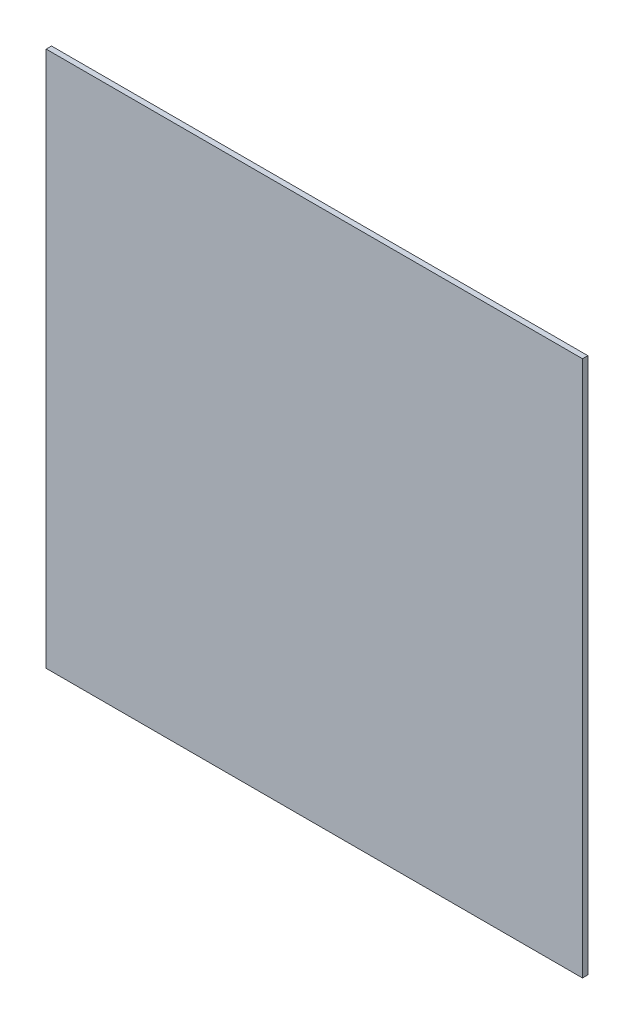
ISO-10303-21;
HEADER;
FILE_DESCRIPTION(('STEP AP214'),'2;1');
FILE_NAME('part.step','',(''),(''),'','','');
FILE_SCHEMA(('AUTOMOTIVE_DESIGN { 1 0 10303 214 1 1 1 1 }'));
ENDSEC;
DATA;
#1=APPLICATION_CONTEXT('core data for automotive mechanical design processes');
#2=APPLICATION_PROTOCOL_DEFINITION('international standard','automotive_design',2000,#1);
#3=PRODUCT_CONTEXT('',#1,'mechanical');
#4=PRODUCT('Part','Part','',(#3));
#5=PRODUCT_RELATED_PRODUCT_CATEGORY('part','',(#4));
#6=PRODUCT_DEFINITION_FORMATION('','',#4);
#7=PRODUCT_DEFINITION_CONTEXT('part definition',#1,'design');
#8=PRODUCT_DEFINITION('design','',#6,#7);
#9=PRODUCT_DEFINITION_SHAPE('','',#8);
#10=(LENGTH_UNIT() NAMED_UNIT(*) SI_UNIT(.MILLI.,.METRE.));
#11=(NAMED_UNIT(*) PLANE_ANGLE_UNIT() SI_UNIT($,.RADIAN.));
#12=(NAMED_UNIT(*) SI_UNIT($,.STERADIAN.) SOLID_ANGLE_UNIT());
#13=UNCERTAINTY_MEASURE_WITH_UNIT(LENGTH_MEASURE(1.E-05),#10,'distance_accuracy_value','');
#14=(GEOMETRIC_REPRESENTATION_CONTEXT(3) GLOBAL_UNCERTAINTY_ASSIGNED_CONTEXT((#13)) GLOBAL_UNIT_ASSIGNED_CONTEXT((#10,
#11,#12)) REPRESENTATION_CONTEXT('',''));
#15=CARTESIAN_POINT('',(0.,0.,0.));
#16=DIRECTION('',(0.,0.,1.));
#17=DIRECTION('',(1.,0.,0.));
#18=AXIS2_PLACEMENT_3D('',#15,#16,#17);
#19=CARTESIAN_POINT('',(-750.,-750.,15.));
#20=DIRECTION('',(1.,0.,0.));
#21=DIRECTION('',(0.,0.,-1.));
#22=AXIS2_PLACEMENT_3D('',#19,#20,#21);
#23=PLANE('',#22);
#24=DIRECTION('',(0.,-1.,0.));
#25=VECTOR('',#24,1.);
#26=CARTESIAN_POINT('',(-750.,-750.,0.));
#27=LINE('',#26,#25);
#28=CARTESIAN_POINT('',(-750.,750.,0.));
#29=VERTEX_POINT('',#28);
#30=CARTESIAN_POINT('',(-750.,-750.,0.));
#31=VERTEX_POINT('',#30);
#32=EDGE_CURVE('E99',#29,#31,#27,.T.);
#33=ORIENTED_EDGE('',*,*,#32,.T.);
#34=DIRECTION('',(0.,0.,-1.));
#35=VECTOR('',#34,1.);
#36=CARTESIAN_POINT('',(-750.,-750.,15.));
#37=LINE('',#36,#35);
#38=CARTESIAN_POINT('',(-750.,-750.,15.));
#39=VERTEX_POINT('',#38);
#40=EDGE_CURVE('E11',#39,#31,#37,.T.);
#41=ORIENTED_EDGE('',*,*,#40,.F.);
#42=DIRECTION('',(0.,-1.,0.));
#43=VECTOR('',#42,1.);
#44=CARTESIAN_POINT('',(-750.,-750.,15.));
#45=LINE('',#44,#43);
#46=CARTESIAN_POINT('',(-750.,750.,15.));
#47=VERTEX_POINT('',#46);
#48=EDGE_CURVE('E87',#47,#39,#45,.T.);
#49=ORIENTED_EDGE('',*,*,#48,.F.);
#50=DIRECTION('',(0.,0.,-1.));
#51=VECTOR('',#50,1.);
#52=CARTESIAN_POINT('',(-750.,750.,15.));
#53=LINE('',#52,#51);
#54=EDGE_CURVE('E95',#47,#29,#53,.T.);
#55=ORIENTED_EDGE('',*,*,#54,.T.);
#56=EDGE_LOOP('',(#33,#41,#49,#55));
#57=FACE_BOUND('',#56,.T.);
#58=ADVANCED_FACE('F36',(#57),#23,.F.);
#59=CARTESIAN_POINT('',(750.,-750.,15.));
#60=DIRECTION('',(0.,1.,0.));
#61=DIRECTION('',(-1.,0.,0.));
#62=AXIS2_PLACEMENT_3D('',#59,#60,#61);
#63=PLANE('',#62);
#64=DIRECTION('',(1.,0.,0.));
#65=VECTOR('',#64,1.);
#66=CARTESIAN_POINT('',(750.,-750.,0.));
#67=LINE('',#66,#65);
#68=CARTESIAN_POINT('',(750.,-750.,0.));
#69=VERTEX_POINT('',#68);
#70=EDGE_CURVE('E91',#31,#69,#67,.T.);
#71=ORIENTED_EDGE('',*,*,#70,.T.);
#72=DIRECTION('',(0.,0.,-1.));
#73=VECTOR('',#72,1.);
#74=CARTESIAN_POINT('',(750.,-750.,15.));
#75=LINE('',#74,#73);
#76=CARTESIAN_POINT('',(750.,-750.,15.));
#77=VERTEX_POINT('',#76);
#78=EDGE_CURVE('E44',#77,#69,#75,.T.);
#79=ORIENTED_EDGE('',*,*,#78,.F.);
#80=DIRECTION('',(1.,0.,0.));
#81=VECTOR('',#80,1.);
#82=CARTESIAN_POINT('',(750.,-750.,15.));
#83=LINE('',#82,#81);
#84=EDGE_CURVE('E82',#39,#77,#83,.T.);
#85=ORIENTED_EDGE('',*,*,#84,.F.);
#86=ORIENTED_EDGE('',*,*,#40,.T.);
#87=EDGE_LOOP('',(#71,#79,#85,#86));
#88=FACE_BOUND('',#87,.T.);
#89=ADVANCED_FACE('F90',(#88),#63,.F.);
#90=CARTESIAN_POINT('',(750.,-750.,15.));
#91=DIRECTION('',(-1.,0.,0.));
#92=DIRECTION('',(0.,0.,1.));
#93=AXIS2_PLACEMENT_3D('',#90,#91,#92);
#94=PLANE('',#93);
#95=DIRECTION('',(0.,1.,0.));
#96=VECTOR('',#95,1.);
#97=CARTESIAN_POINT('',(750.,-750.,0.));
#98=LINE('',#97,#96);
#99=CARTESIAN_POINT('',(750.,750.,0.));
#100=VERTEX_POINT('',#99);
#101=EDGE_CURVE('E69',#69,#100,#98,.T.);
#102=ORIENTED_EDGE('',*,*,#101,.T.);
#103=DIRECTION('',(0.,0.,-1.));
#104=VECTOR('',#103,1.);
#105=CARTESIAN_POINT('',(750.,750.,15.));
#106=LINE('',#105,#104);
#107=CARTESIAN_POINT('',(750.,750.,15.));
#108=VERTEX_POINT('',#107);
#109=EDGE_CURVE('E92',#108,#100,#106,.T.);
#110=ORIENTED_EDGE('',*,*,#109,.F.);
#111=DIRECTION('',(0.,1.,0.));
#112=VECTOR('',#111,1.);
#113=CARTESIAN_POINT('',(750.,-750.,15.));
#114=LINE('',#113,#112);
#115=EDGE_CURVE('E85',#77,#108,#114,.T.);
#116=ORIENTED_EDGE('',*,*,#115,.F.);
#117=ORIENTED_EDGE('',*,*,#78,.T.);
#118=EDGE_LOOP('',(#102,#110,#116,#117));
#119=FACE_BOUND('',#118,.T.);
#120=ADVANCED_FACE('F93',(#119),#94,.F.);
#121=CARTESIAN_POINT('',(750.,750.,15.));
#122=DIRECTION('',(0.,-1.,0.));
#123=DIRECTION('',(1.,0.,0.));
#124=AXIS2_PLACEMENT_3D('',#121,#122,#123);
#125=PLANE('',#124);
#126=DIRECTION('',(-1.,0.,0.));
#127=VECTOR('',#126,1.);
#128=CARTESIAN_POINT('',(750.,750.,0.));
#129=LINE('',#128,#127);
#130=EDGE_CURVE('E75',#100,#29,#129,.T.);
#131=ORIENTED_EDGE('',*,*,#130,.T.);
#132=ORIENTED_EDGE('',*,*,#54,.F.);
#133=DIRECTION('',(-1.,0.,0.));
#134=VECTOR('',#133,1.);
#135=CARTESIAN_POINT('',(750.,750.,15.));
#136=LINE('',#135,#134);
#137=EDGE_CURVE('E52',#108,#47,#136,.T.);
#138=ORIENTED_EDGE('',*,*,#137,.F.);
#139=ORIENTED_EDGE('',*,*,#109,.T.);
#140=EDGE_LOOP('',(#131,#132,#138,#139));
#141=FACE_BOUND('',#140,.T.);
#142=ADVANCED_FACE('F106',(#141),#125,.F.);
#143=CARTESIAN_POINT('',(0.,0.,15.));
#144=DIRECTION('',(0.,0.,1.));
#145=DIRECTION('',(1.,0.,0.));
#146=AXIS2_PLACEMENT_3D('',#143,#144,#145);
#147=PLANE('',#146);
#148=ORIENTED_EDGE('',*,*,#48,.T.);
#149=ORIENTED_EDGE('',*,*,#84,.T.);
#150=ORIENTED_EDGE('',*,*,#115,.T.);
#151=ORIENTED_EDGE('',*,*,#137,.T.);
#152=EDGE_LOOP('',(#148,#149,#150,#151));
#153=FACE_BOUND('',#152,.T.);
#154=ADVANCED_FACE('F83',(#153),#147,.T.);
#155=CARTESIAN_POINT('',(0.,0.,0.));
#156=DIRECTION('',(0.,0.,1.));
#157=DIRECTION('',(1.,0.,0.));
#158=AXIS2_PLACEMENT_3D('',#155,#156,#157);
#159=PLANE('',#158);
#160=ORIENTED_EDGE('',*,*,#32,.F.);
#161=ORIENTED_EDGE('',*,*,#130,.F.);
#162=ORIENTED_EDGE('',*,*,#101,.F.);
#163=ORIENTED_EDGE('',*,*,#70,.F.);
#164=EDGE_LOOP('',(#160,#161,#162,#163));
#165=FACE_BOUND('',#164,.T.);
#166=ADVANCED_FACE('F109',(#165),#159,.F.);
#167=CLOSED_SHELL('',(#58,#89,#120,#142,#154,#166));
#168=MANIFOLD_SOLID_BREP('B2',#167);
#169=ADVANCED_BREP_SHAPE_REPRESENTATION('',(#18,#168),#14);
#170=SHAPE_DEFINITION_REPRESENTATION(#9,#169);
ENDSEC;
END-ISO-10303-21;
